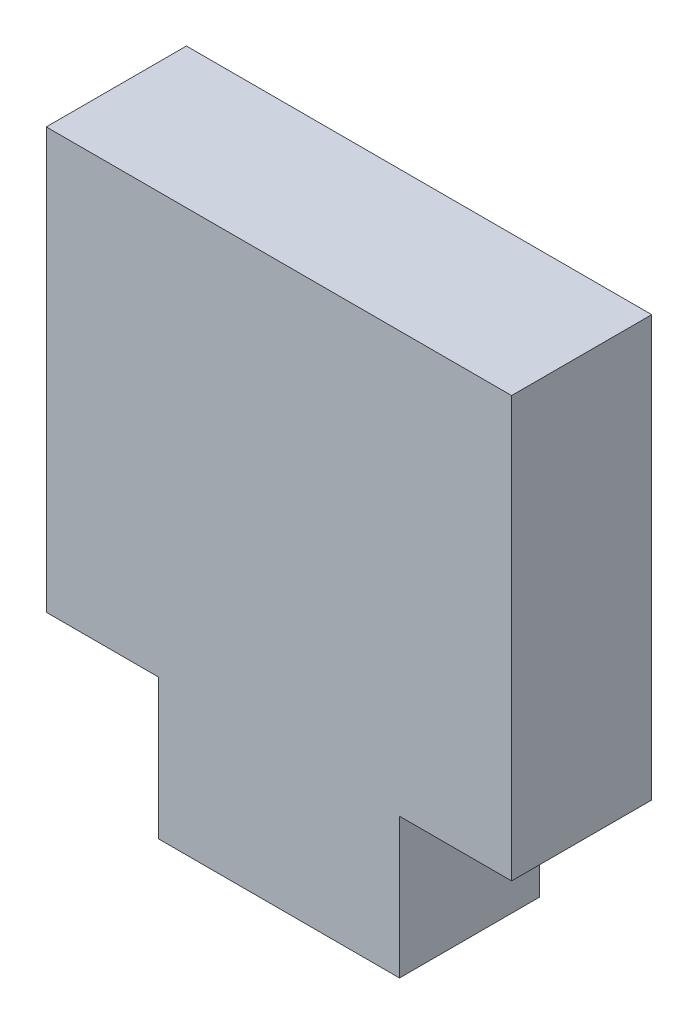
ISO-10303-21;
HEADER;
FILE_DESCRIPTION(('STEP AP214'),'2;1');
FILE_NAME('part.step','',(''),(''),'','','');
FILE_SCHEMA(('AUTOMOTIVE_DESIGN { 1 0 10303 214 1 1 1 1 }'));
ENDSEC;
DATA;
#1=APPLICATION_CONTEXT('core data for automotive mechanical design processes');
#2=APPLICATION_PROTOCOL_DEFINITION('international standard','automotive_design',2000,#1);
#3=PRODUCT_CONTEXT('',#1,'mechanical');
#4=PRODUCT('Part','Part','',(#3));
#5=PRODUCT_RELATED_PRODUCT_CATEGORY('part','',(#4));
#6=PRODUCT_DEFINITION_FORMATION('','',#4);
#7=PRODUCT_DEFINITION_CONTEXT('part definition',#1,'design');
#8=PRODUCT_DEFINITION('design','',#6,#7);
#9=PRODUCT_DEFINITION_SHAPE('','',#8);
#10=(LENGTH_UNIT() NAMED_UNIT(*) SI_UNIT(.MILLI.,.METRE.));
#11=(NAMED_UNIT(*) PLANE_ANGLE_UNIT() SI_UNIT($,.RADIAN.));
#12=(NAMED_UNIT(*) SI_UNIT($,.STERADIAN.) SOLID_ANGLE_UNIT());
#13=UNCERTAINTY_MEASURE_WITH_UNIT(LENGTH_MEASURE(1.E-05),#10,'distance_accuracy_value','');
#14=(GEOMETRIC_REPRESENTATION_CONTEXT(3) GLOBAL_UNCERTAINTY_ASSIGNED_CONTEXT((#13)) GLOBAL_UNIT_ASSIGNED_CONTEXT((#10,
#11,#12)) REPRESENTATION_CONTEXT('',''));
#15=CARTESIAN_POINT('',(0.,0.,0.));
#16=DIRECTION('',(0.,0.,1.));
#17=DIRECTION('',(1.,0.,0.));
#18=AXIS2_PLACEMENT_3D('',#15,#16,#17);
#19=CARTESIAN_POINT('',(30.6895539790369,14.3682083395516,5.));
#20=DIRECTION('',(-1.,0.,0.));
#21=DIRECTION('',(0.,0.,1.));
#22=AXIS2_PLACEMENT_3D('',#19,#20,#21);
#23=PLANE('',#22);
#24=DIRECTION('',(0.,1.,0.));
#25=VECTOR('',#24,1.);
#26=CARTESIAN_POINT('',(30.6895539790369,14.3682083395516,0.));
#27=LINE('',#26,#25);
#28=CARTESIAN_POINT('',(30.6895539790369,14.3682083395516,0.));
#29=VERTEX_POINT('',#28);
#30=CARTESIAN_POINT('',(30.6895539790369,19.3682083395516,0.));
#31=VERTEX_POINT('',#30);
#32=EDGE_CURVE('E133',#29,#31,#27,.T.);
#33=ORIENTED_EDGE('',*,*,#32,.T.);
#34=DIRECTION('',(0.,0.,-1.));
#35=VECTOR('',#34,1.);
#36=CARTESIAN_POINT('',(30.6895539790369,19.3682083395516,5.));
#37=LINE('',#36,#35);
#38=CARTESIAN_POINT('',(30.6895539790369,19.3682083395516,5.));
#39=VERTEX_POINT('',#38);
#40=EDGE_CURVE('E11',#39,#31,#37,.T.);
#41=ORIENTED_EDGE('',*,*,#40,.F.);
#42=DIRECTION('',(0.,1.,0.));
#43=VECTOR('',#42,1.);
#44=CARTESIAN_POINT('',(30.6895539790369,14.3682083395516,5.));
#45=LINE('',#44,#43);
#46=CARTESIAN_POINT('',(30.6895539790369,14.3682083395516,5.));
#47=VERTEX_POINT('',#46);
#48=EDGE_CURVE('E147',#47,#39,#45,.T.);
#49=ORIENTED_EDGE('',*,*,#48,.F.);
#50=DIRECTION('',(0.,0.,-1.));
#51=VECTOR('',#50,1.);
#52=CARTESIAN_POINT('',(30.6895539790369,14.3682083395516,5.));
#53=LINE('',#52,#51);
#54=EDGE_CURVE('E129',#47,#29,#53,.T.);
#55=ORIENTED_EDGE('',*,*,#54,.T.);
#56=EDGE_LOOP('',(#33,#41,#49,#55));
#57=FACE_BOUND('',#56,.T.);
#58=ADVANCED_FACE('F37',(#57),#23,.F.);
#59=CARTESIAN_POINT('',(34.6895539790369,19.3682083395516,5.));
#60=DIRECTION('',(0.,1.,0.));
#61=DIRECTION('',(0.,0.,1.));
#62=AXIS2_PLACEMENT_3D('',#59,#60,#61);
#63=PLANE('',#62);
#64=DIRECTION('',(1.,0.,0.));
#65=VECTOR('',#64,1.);
#66=CARTESIAN_POINT('',(34.6895539790369,19.3682083395516,0.));
#67=LINE('',#66,#65);
#68=CARTESIAN_POINT('',(34.6895539790369,19.3682083395516,0.));
#69=VERTEX_POINT('',#68);
#70=EDGE_CURVE('E136',#31,#69,#67,.T.);
#71=ORIENTED_EDGE('',*,*,#70,.T.);
#72=DIRECTION('',(0.,0.,-1.));
#73=VECTOR('',#72,1.);
#74=CARTESIAN_POINT('',(34.6895539790369,19.3682083395516,5.));
#75=LINE('',#74,#73);
#76=CARTESIAN_POINT('',(34.6895539790369,19.3682083395516,5.));
#77=VERTEX_POINT('',#76);
#78=EDGE_CURVE('E45',#77,#69,#75,.T.);
#79=ORIENTED_EDGE('',*,*,#78,.F.);
#80=DIRECTION('',(1.,0.,0.));
#81=VECTOR('',#80,1.);
#82=CARTESIAN_POINT('',(34.6895539790369,19.3682083395516,5.));
#83=LINE('',#82,#81);
#84=EDGE_CURVE('E96',#39,#77,#83,.T.);
#85=ORIENTED_EDGE('',*,*,#84,.F.);
#86=ORIENTED_EDGE('',*,*,#40,.T.);
#87=EDGE_LOOP('',(#71,#79,#85,#86));
#88=FACE_BOUND('',#87,.T.);
#89=ADVANCED_FACE('F182',(#88),#63,.F.);
#90=CARTESIAN_POINT('',(34.6895539790369,19.3682083395516,5.));
#91=DIRECTION('',(-1.,0.,0.));
#92=DIRECTION('',(0.,0.,1.));
#93=AXIS2_PLACEMENT_3D('',#90,#91,#92);
#94=PLANE('',#93);
#95=DIRECTION('',(0.,1.,0.));
#96=VECTOR('',#95,1.);
#97=CARTESIAN_POINT('',(34.6895539790369,19.3682083395516,0.));
#98=LINE('',#97,#96);
#99=CARTESIAN_POINT('',(34.6895539790369,34.3682083395516,0.));
#100=VERTEX_POINT('',#99);
#101=EDGE_CURVE('E138',#69,#100,#98,.T.);
#102=ORIENTED_EDGE('',*,*,#101,.T.);
#103=DIRECTION('',(0.,0.,-1.));
#104=VECTOR('',#103,1.);
#105=CARTESIAN_POINT('',(34.6895539790369,34.3682083395516,5.));
#106=LINE('',#105,#104);
#107=CARTESIAN_POINT('',(34.6895539790369,34.3682083395516,5.));
#108=VERTEX_POINT('',#107);
#109=EDGE_CURVE('E154',#108,#100,#106,.T.);
#110=ORIENTED_EDGE('',*,*,#109,.F.);
#111=DIRECTION('',(0.,1.,0.));
#112=VECTOR('',#111,1.);
#113=CARTESIAN_POINT('',(34.6895539790369,19.3682083395516,5.));
#114=LINE('',#113,#112);
#115=EDGE_CURVE('E162',#77,#108,#114,.T.);
#116=ORIENTED_EDGE('',*,*,#115,.F.);
#117=ORIENTED_EDGE('',*,*,#78,.T.);
#118=EDGE_LOOP('',(#102,#110,#116,#117));
#119=FACE_BOUND('',#118,.T.);
#120=ADVANCED_FACE('F160',(#119),#94,.F.);
#121=CARTESIAN_POINT('',(34.6895539790369,34.3682083395516,5.));
#122=DIRECTION('',(0.,-1.,0.));
#123=DIRECTION('',(1.,0.,0.));
#124=AXIS2_PLACEMENT_3D('',#121,#122,#123);
#125=PLANE('',#124);
#126=DIRECTION('',(-1.,0.,0.));
#127=VECTOR('',#126,1.);
#128=CARTESIAN_POINT('',(34.6895539790369,34.3682083395516,0.));
#129=LINE('',#128,#127);
#130=CARTESIAN_POINT('',(18.0852539790369,34.3682083395516,0.));
#131=VERTEX_POINT('',#130);
#132=EDGE_CURVE('E140',#100,#131,#129,.T.);
#133=ORIENTED_EDGE('',*,*,#132,.T.);
#134=DIRECTION('',(0.,0.,-1.));
#135=VECTOR('',#134,1.);
#136=CARTESIAN_POINT('',(18.0852539790369,34.3682083395516,5.));
#137=LINE('',#136,#135);
#138=CARTESIAN_POINT('',(18.0852539790369,34.3682083395516,5.));
#139=VERTEX_POINT('',#138);
#140=EDGE_CURVE('E151',#139,#131,#137,.T.);
#141=ORIENTED_EDGE('',*,*,#140,.F.);
#142=DIRECTION('',(-1.,0.,0.));
#143=VECTOR('',#142,1.);
#144=CARTESIAN_POINT('',(34.6895539790369,34.3682083395516,5.));
#145=LINE('',#144,#143);
#146=EDGE_CURVE('E174',#108,#139,#145,.T.);
#147=ORIENTED_EDGE('',*,*,#146,.F.);
#148=ORIENTED_EDGE('',*,*,#109,.T.);
#149=EDGE_LOOP('',(#133,#141,#147,#148));
#150=FACE_BOUND('',#149,.T.);
#151=ADVANCED_FACE('F170',(#150),#125,.F.);
#152=CARTESIAN_POINT('',(18.0852539790369,19.3682083395516,5.));
#153=DIRECTION('',(1.,0.,0.));
#154=DIRECTION('',(0.,0.,-1.));
#155=AXIS2_PLACEMENT_3D('',#152,#153,#154);
#156=PLANE('',#155);
#157=DIRECTION('',(0.,-1.,0.));
#158=VECTOR('',#157,1.);
#159=CARTESIAN_POINT('',(18.0852539790369,19.3682083395516,0.));
#160=LINE('',#159,#158);
#161=CARTESIAN_POINT('',(18.0852539790369,19.3682083395516,0.));
#162=VERTEX_POINT('',#161);
#163=EDGE_CURVE('E142',#131,#162,#160,.T.);
#164=ORIENTED_EDGE('',*,*,#163,.T.);
#165=DIRECTION('',(0.,0.,-1.));
#166=VECTOR('',#165,1.);
#167=CARTESIAN_POINT('',(18.0852539790369,19.3682083395516,5.));
#168=LINE('',#167,#166);
#169=CARTESIAN_POINT('',(18.0852539790369,19.3682083395516,5.));
#170=VERTEX_POINT('',#169);
#171=EDGE_CURVE('E124',#170,#162,#168,.T.);
#172=ORIENTED_EDGE('',*,*,#171,.F.);
#173=DIRECTION('',(0.,-1.,0.));
#174=VECTOR('',#173,1.);
#175=CARTESIAN_POINT('',(18.0852539790369,19.3682083395516,5.));
#176=LINE('',#175,#174);
#177=EDGE_CURVE('E115',#139,#170,#176,.T.);
#178=ORIENTED_EDGE('',*,*,#177,.F.);
#179=ORIENTED_EDGE('',*,*,#140,.T.);
#180=EDGE_LOOP('',(#164,#172,#178,#179));
#181=FACE_BOUND('',#180,.T.);
#182=ADVANCED_FACE('F173',(#181),#156,.F.);
#183=CARTESIAN_POINT('',(22.0852539790369,19.3682083395516,5.));
#184=DIRECTION('',(0.,1.,0.));
#185=DIRECTION('',(0.,0.,1.));
#186=AXIS2_PLACEMENT_3D('',#183,#184,#185);
#187=PLANE('',#186);
#188=DIRECTION('',(1.,0.,0.));
#189=VECTOR('',#188,1.);
#190=CARTESIAN_POINT('',(22.0852539790369,19.3682083395516,0.));
#191=LINE('',#190,#189);
#192=CARTESIAN_POINT('',(22.0852539790369,19.3682083395516,0.));
#193=VERTEX_POINT('',#192);
#194=EDGE_CURVE('E123',#162,#193,#191,.T.);
#195=ORIENTED_EDGE('',*,*,#194,.T.);
#196=DIRECTION('',(0.,0.,-1.));
#197=VECTOR('',#196,1.);
#198=CARTESIAN_POINT('',(22.0852539790369,19.3682083395516,5.));
#199=LINE('',#198,#197);
#200=CARTESIAN_POINT('',(22.0852539790369,19.3682083395516,5.));
#201=VERTEX_POINT('',#200);
#202=EDGE_CURVE('E120',#201,#193,#199,.T.);
#203=ORIENTED_EDGE('',*,*,#202,.F.);
#204=DIRECTION('',(1.,0.,0.));
#205=VECTOR('',#204,1.);
#206=CARTESIAN_POINT('',(22.0852539790369,19.3682083395516,5.));
#207=LINE('',#206,#205);
#208=EDGE_CURVE('E109',#170,#201,#207,.T.);
#209=ORIENTED_EDGE('',*,*,#208,.F.);
#210=ORIENTED_EDGE('',*,*,#171,.T.);
#211=EDGE_LOOP('',(#195,#203,#209,#210));
#212=FACE_BOUND('',#211,.T.);
#213=ADVANCED_FACE('F121',(#212),#187,.F.);
#214=CARTESIAN_POINT('',(22.0852539790369,14.3682083395516,5.));
#215=DIRECTION('',(1.,0.,0.));
#216=DIRECTION('',(0.,0.,-1.));
#217=AXIS2_PLACEMENT_3D('',#214,#215,#216);
#218=PLANE('',#217);
#219=DIRECTION('',(0.,-1.,0.));
#220=VECTOR('',#219,1.);
#221=CARTESIAN_POINT('',(22.0852539790369,14.3682083395516,0.));
#222=LINE('',#221,#220);
#223=CARTESIAN_POINT('',(22.0852539790369,14.3682083395516,0.));
#224=VERTEX_POINT('',#223);
#225=EDGE_CURVE('E82',#193,#224,#222,.T.);
#226=ORIENTED_EDGE('',*,*,#225,.T.);
#227=DIRECTION('',(0.,0.,-1.));
#228=VECTOR('',#227,1.);
#229=CARTESIAN_POINT('',(22.0852539790369,14.3682083395516,5.));
#230=LINE('',#229,#228);
#231=CARTESIAN_POINT('',(22.0852539790369,14.3682083395516,5.));
#232=VERTEX_POINT('',#231);
#233=EDGE_CURVE('E125',#232,#224,#230,.T.);
#234=ORIENTED_EDGE('',*,*,#233,.F.);
#235=DIRECTION('',(0.,-1.,0.));
#236=VECTOR('',#235,1.);
#237=CARTESIAN_POINT('',(22.0852539790369,14.3682083395516,5.));
#238=LINE('',#237,#236);
#239=EDGE_CURVE('E113',#201,#232,#238,.T.);
#240=ORIENTED_EDGE('',*,*,#239,.F.);
#241=ORIENTED_EDGE('',*,*,#202,.T.);
#242=EDGE_LOOP('',(#226,#234,#240,#241));
#243=FACE_BOUND('',#242,.T.);
#244=ADVANCED_FACE('F127',(#243),#218,.F.);
#245=CARTESIAN_POINT('',(30.6895539790369,14.3682083395516,5.));
#246=DIRECTION('',(0.,1.,0.));
#247=DIRECTION('',(0.,0.,1.));
#248=AXIS2_PLACEMENT_3D('',#245,#246,#247);
#249=PLANE('',#248);
#250=DIRECTION('',(1.,0.,0.));
#251=VECTOR('',#250,1.);
#252=CARTESIAN_POINT('',(30.6895539790369,14.3682083395516,0.));
#253=LINE('',#252,#251);
#254=EDGE_CURVE('E88',#224,#29,#253,.T.);
#255=ORIENTED_EDGE('',*,*,#254,.T.);
#256=ORIENTED_EDGE('',*,*,#54,.F.);
#257=DIRECTION('',(1.,0.,0.));
#258=VECTOR('',#257,1.);
#259=CARTESIAN_POINT('',(30.6895539790369,14.3682083395516,5.));
#260=LINE('',#259,#258);
#261=EDGE_CURVE('E53',#232,#47,#260,.T.);
#262=ORIENTED_EDGE('',*,*,#261,.F.);
#263=ORIENTED_EDGE('',*,*,#233,.T.);
#264=EDGE_LOOP('',(#255,#256,#262,#263));
#265=FACE_BOUND('',#264,.T.);
#266=ADVANCED_FACE('F198',(#265),#249,.F.);
#267=CARTESIAN_POINT('',(0.,0.,5.));
#268=DIRECTION('',(0.,0.,1.));
#269=DIRECTION('',(1.,0.,0.));
#270=AXIS2_PLACEMENT_3D('',#267,#268,#269);
#271=PLANE('',#270);
#272=ORIENTED_EDGE('',*,*,#48,.T.);
#273=ORIENTED_EDGE('',*,*,#84,.T.);
#274=ORIENTED_EDGE('',*,*,#115,.T.);
#275=ORIENTED_EDGE('',*,*,#146,.T.);
#276=ORIENTED_EDGE('',*,*,#177,.T.);
#277=ORIENTED_EDGE('',*,*,#208,.T.);
#278=ORIENTED_EDGE('',*,*,#239,.T.);
#279=ORIENTED_EDGE('',*,*,#261,.T.);
#280=EDGE_LOOP('',(#272,#273,#274,#275,#276,#277,#278,#279));
#281=FACE_BOUND('',#280,.T.);
#282=ADVANCED_FACE('F111',(#281),#271,.T.);
#283=CARTESIAN_POINT('',(0.,0.,0.));
#284=DIRECTION('',(0.,0.,1.));
#285=DIRECTION('',(1.,0.,0.));
#286=AXIS2_PLACEMENT_3D('',#283,#284,#285);
#287=PLANE('',#286);
#288=ORIENTED_EDGE('',*,*,#32,.F.);
#289=ORIENTED_EDGE('',*,*,#254,.F.);
#290=ORIENTED_EDGE('',*,*,#225,.F.);
#291=ORIENTED_EDGE('',*,*,#194,.F.);
#292=ORIENTED_EDGE('',*,*,#163,.F.);
#293=ORIENTED_EDGE('',*,*,#132,.F.);
#294=ORIENTED_EDGE('',*,*,#101,.F.);
#295=ORIENTED_EDGE('',*,*,#70,.F.);
#296=EDGE_LOOP('',(#288,#289,#290,#291,#292,#293,#294,#295));
#297=FACE_BOUND('',#296,.T.);
#298=ADVANCED_FACE('F166',(#297),#287,.F.);
#299=CLOSED_SHELL('',(#58,#89,#120,#151,#182,#213,#244,#266,#282,#298));
#300=MANIFOLD_SOLID_BREP('B2',#299);
#301=ADVANCED_BREP_SHAPE_REPRESENTATION('',(#18,#300),#14);
#302=SHAPE_DEFINITION_REPRESENTATION(#9,#301);
ENDSEC;
END-ISO-10303-21;
